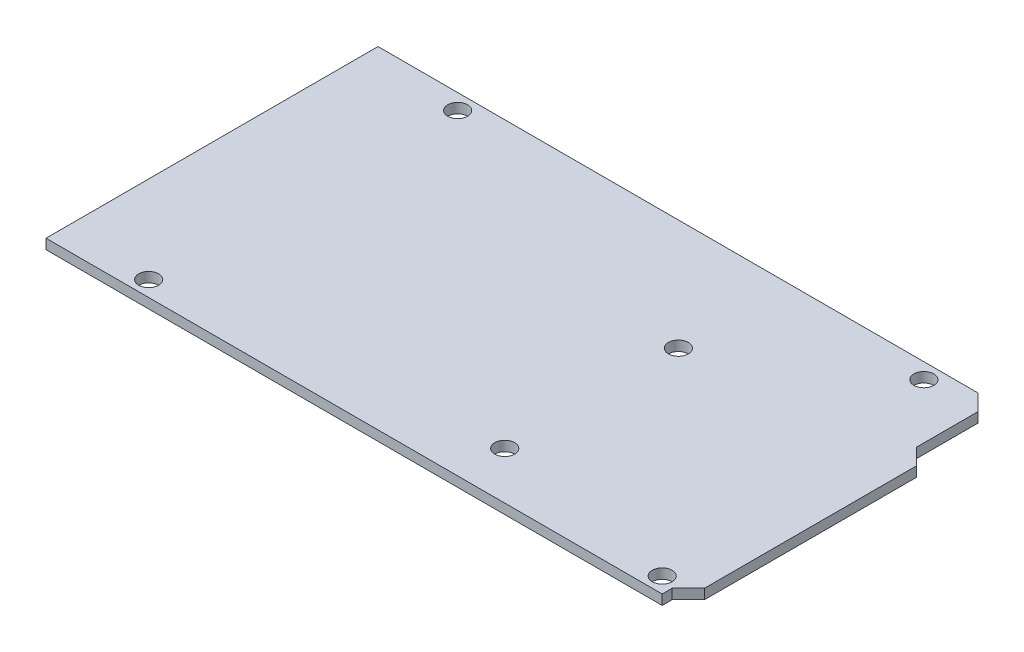
ISO-10303-21;
HEADER;
FILE_DESCRIPTION(('STEP AP214'),'2;1');
FILE_NAME('part.step','',(''),(''),'','','');
FILE_SCHEMA(('AUTOMOTIVE_DESIGN { 1 0 10303 214 1 1 1 1 }'));
ENDSEC;
DATA;
#1=APPLICATION_CONTEXT('core data for automotive mechanical design processes');
#2=APPLICATION_PROTOCOL_DEFINITION('international standard','automotive_design',2000,#1);
#3=PRODUCT_CONTEXT('',#1,'mechanical');
#4=PRODUCT('Part','Part','',(#3));
#5=PRODUCT_RELATED_PRODUCT_CATEGORY('part','',(#4));
#6=PRODUCT_DEFINITION_FORMATION('','',#4);
#7=PRODUCT_DEFINITION_CONTEXT('part definition',#1,'design');
#8=PRODUCT_DEFINITION('design','',#6,#7);
#9=PRODUCT_DEFINITION_SHAPE('','',#8);
#10=(LENGTH_UNIT() NAMED_UNIT(*) SI_UNIT(.MILLI.,.METRE.));
#11=(NAMED_UNIT(*) PLANE_ANGLE_UNIT() SI_UNIT($,.RADIAN.));
#12=(NAMED_UNIT(*) SI_UNIT($,.STERADIAN.) SOLID_ANGLE_UNIT());
#13=UNCERTAINTY_MEASURE_WITH_UNIT(LENGTH_MEASURE(1.E-05),#10,'distance_accuracy_value','');
#14=(GEOMETRIC_REPRESENTATION_CONTEXT(3) GLOBAL_UNCERTAINTY_ASSIGNED_CONTEXT((#13)) GLOBAL_UNIT_ASSIGNED_CONTEXT((#10,
#11,#12)) REPRESENTATION_CONTEXT('',''));
#15=CARTESIAN_POINT('',(0.,0.,0.));
#16=DIRECTION('',(0.,0.,1.));
#17=DIRECTION('',(1.,0.,0.));
#18=AXIS2_PLACEMENT_3D('',#15,#16,#17);
#19=CARTESIAN_POINT('',(48.2000000000001,1.6,25.0700000000001));
#20=DIRECTION('',(-0.707106781186566,0.,-0.707106781186529));
#21=DIRECTION('',(-0.707106781186529,0.,0.707106781186566));
#22=AXIS2_PLACEMENT_3D('',#19,#20,#21);
#23=PLANE('',#22);
#24=DIRECTION('',(0.707106781186529,0.,-0.707106781186566));
#25=VECTOR('',#24,1.);
#26=CARTESIAN_POINT('',(48.2000000000001,0.,25.0700000000001));
#27=LINE('',#26,#25);
#28=CARTESIAN_POINT('',(48.2000000000001,0.,25.0700000000001));
#29=VERTEX_POINT('',#28);
#30=CARTESIAN_POINT('',(50.8,0.,22.47));
#31=VERTEX_POINT('',#30);
#32=EDGE_CURVE('E141',#29,#31,#27,.T.);
#33=ORIENTED_EDGE('',*,*,#32,.T.);
#34=DIRECTION('',(0.,-1.,0.));
#35=VECTOR('',#34,1.);
#36=CARTESIAN_POINT('',(50.8,1.6,22.47));
#37=LINE('',#36,#35);
#38=CARTESIAN_POINT('',(50.8,1.6,22.47));
#39=VERTEX_POINT('',#38);
#40=EDGE_CURVE('E11',#39,#31,#37,.T.);
#41=ORIENTED_EDGE('',*,*,#40,.F.);
#42=DIRECTION('',(0.707106781186529,0.,-0.707106781186566));
#43=VECTOR('',#42,1.);
#44=CARTESIAN_POINT('',(48.2000000000001,1.6,25.0700000000001));
#45=LINE('',#44,#43);
#46=CARTESIAN_POINT('',(48.2000000000001,1.6,25.0700000000001));
#47=VERTEX_POINT('',#46);
#48=EDGE_CURVE('E158',#47,#39,#45,.T.);
#49=ORIENTED_EDGE('',*,*,#48,.F.);
#50=DIRECTION('',(0.,-1.,0.));
#51=VECTOR('',#50,1.);
#52=CARTESIAN_POINT('',(48.2000000000001,1.6,25.0700000000001));
#53=LINE('',#52,#51);
#54=EDGE_CURVE('E137',#47,#29,#53,.T.);
#55=ORIENTED_EDGE('',*,*,#54,.T.);
#56=EDGE_LOOP('',(#33,#41,#49,#55));
#57=FACE_BOUND('',#56,.T.);
#58=ADVANCED_FACE('F37',(#57),#23,.F.);
#59=CARTESIAN_POINT('',(50.8,1.6,22.47));
#60=DIRECTION('',(-1.,0.,0.));
#61=DIRECTION('',(0.,0.,1.));
#62=AXIS2_PLACEMENT_3D('',#59,#60,#61);
#63=PLANE('',#62);
#64=DIRECTION('',(0.,0.,-1.));
#65=VECTOR('',#64,1.);
#66=CARTESIAN_POINT('',(50.8,0.,22.47));
#67=LINE('',#66,#65);
#68=CARTESIAN_POINT('',(50.8,0.,-11.5868711410477));
#69=VERTEX_POINT('',#68);
#70=EDGE_CURVE('E144',#31,#69,#67,.T.);
#71=ORIENTED_EDGE('',*,*,#70,.T.);
#72=DIRECTION('',(0.,-1.,0.));
#73=VECTOR('',#72,1.);
#74=CARTESIAN_POINT('',(50.8,1.6,-11.5868711410477));
#75=LINE('',#74,#73);
#76=CARTESIAN_POINT('',(50.8,1.6,-11.5868711410477));
#77=VERTEX_POINT('',#76);
#78=EDGE_CURVE('E46',#77,#69,#75,.T.);
#79=ORIENTED_EDGE('',*,*,#78,.F.);
#80=DIRECTION('',(0.,0.,-1.));
#81=VECTOR('',#80,1.);
#82=CARTESIAN_POINT('',(50.8,1.6,22.47));
#83=LINE('',#82,#81);
#84=EDGE_CURVE('E101',#39,#77,#83,.T.);
#85=ORIENTED_EDGE('',*,*,#84,.F.);
#86=ORIENTED_EDGE('',*,*,#40,.T.);
#87=EDGE_LOOP('',(#71,#79,#85,#86));
#88=FACE_BOUND('',#87,.T.);
#89=ADVANCED_FACE('F244',(#88),#63,.F.);
#90=CARTESIAN_POINT('',(50.8,1.6,-11.5868711410477));
#91=DIRECTION('',(-0.707106781186548,0.,0.707106781186548));
#92=DIRECTION('',(0.707106781186548,0.,0.707106781186548));
#93=AXIS2_PLACEMENT_3D('',#90,#91,#92);
#94=PLANE('',#93);
#95=DIRECTION('',(-0.707106781186547,0.,-0.707106781186547));
#96=VECTOR('',#95,1.);
#97=CARTESIAN_POINT('',(50.8,0.,-11.5868711410477));
#98=LINE('',#97,#96);
#99=CARTESIAN_POINT('',(48.2,0.,-14.1868711410477));
#100=VERTEX_POINT('',#99);
#101=EDGE_CURVE('E147',#69,#100,#98,.T.);
#102=ORIENTED_EDGE('',*,*,#101,.T.);
#103=DIRECTION('',(0.,-1.,0.));
#104=VECTOR('',#103,1.);
#105=CARTESIAN_POINT('',(48.2,1.6,-14.1868711410477));
#106=LINE('',#105,#104);
#107=CARTESIAN_POINT('',(48.2,1.6,-14.1868711410477));
#108=VERTEX_POINT('',#107);
#109=EDGE_CURVE('E168',#108,#100,#106,.T.);
#110=ORIENTED_EDGE('',*,*,#109,.F.);
#111=DIRECTION('',(-0.707106781186547,0.,-0.707106781186547));
#112=VECTOR('',#111,1.);
#113=CARTESIAN_POINT('',(50.8,1.6,-11.5868711410477));
#114=LINE('',#113,#112);
#115=EDGE_CURVE('E210',#77,#108,#114,.T.);
#116=ORIENTED_EDGE('',*,*,#115,.F.);
#117=ORIENTED_EDGE('',*,*,#78,.T.);
#118=EDGE_LOOP('',(#102,#110,#116,#117));
#119=FACE_BOUND('',#118,.T.);
#120=ADVANCED_FACE('F248',(#119),#94,.F.);
#121=CARTESIAN_POINT('',(48.2,1.6,-24.0700000000001));
#122=DIRECTION('',(-1.,0.,0.));
#123=DIRECTION('',(0.,0.,1.));
#124=AXIS2_PLACEMENT_3D('',#121,#122,#123);
#125=PLANE('',#124);
#126=DIRECTION('',(0.,0.,-1.));
#127=VECTOR('',#126,1.);
#128=CARTESIAN_POINT('',(48.2,0.,-24.0700000000001));
#129=LINE('',#128,#127);
#130=CARTESIAN_POINT('',(48.2,0.,-24.0700000000001));
#131=VERTEX_POINT('',#130);
#132=EDGE_CURVE('E149',#100,#131,#129,.T.);
#133=ORIENTED_EDGE('',*,*,#132,.T.);
#134=DIRECTION('',(0.,-1.,0.));
#135=VECTOR('',#134,1.);
#136=CARTESIAN_POINT('',(48.2,1.6,-24.0700000000001));
#137=LINE('',#136,#135);
#138=CARTESIAN_POINT('',(48.2,1.6,-24.0700000000001));
#139=VERTEX_POINT('',#138);
#140=EDGE_CURVE('E165',#139,#131,#137,.T.);
#141=ORIENTED_EDGE('',*,*,#140,.F.);
#142=DIRECTION('',(0.,0.,-1.));
#143=VECTOR('',#142,1.);
#144=CARTESIAN_POINT('',(48.2,1.6,-24.0700000000001));
#145=LINE('',#144,#143);
#146=EDGE_CURVE('E212',#108,#139,#145,.T.);
#147=ORIENTED_EDGE('',*,*,#146,.F.);
#148=ORIENTED_EDGE('',*,*,#109,.T.);
#149=EDGE_LOOP('',(#133,#141,#147,#148));
#150=FACE_BOUND('',#149,.T.);
#151=ADVANCED_FACE('F252',(#150),#125,.F.);
#152=CARTESIAN_POINT('',(45.6,1.6,-26.67));
#153=DIRECTION('',(-0.707106781186543,0.,0.707106781186552));
#154=DIRECTION('',(0.707106781186552,0.,0.707106781186543));
#155=AXIS2_PLACEMENT_3D('',#152,#153,#154);
#156=PLANE('',#155);
#157=DIRECTION('',(-0.707106781186552,0.,-0.707106781186543));
#158=VECTOR('',#157,1.);
#159=CARTESIAN_POINT('',(45.6,0.,-26.67));
#160=LINE('',#159,#158);
#161=CARTESIAN_POINT('',(45.6,0.,-26.67));
#162=VERTEX_POINT('',#161);
#163=EDGE_CURVE('E151',#131,#162,#160,.T.);
#164=ORIENTED_EDGE('',*,*,#163,.T.);
#165=DIRECTION('',(0.,-1.,0.));
#166=VECTOR('',#165,1.);
#167=CARTESIAN_POINT('',(45.6,1.6,-26.67));
#168=LINE('',#167,#166);
#169=CARTESIAN_POINT('',(45.6,1.6,-26.67));
#170=VERTEX_POINT('',#169);
#171=EDGE_CURVE('E162',#170,#162,#168,.T.);
#172=ORIENTED_EDGE('',*,*,#171,.F.);
#173=DIRECTION('',(-0.707106781186552,0.,-0.707106781186543));
#174=VECTOR('',#173,1.);
#175=CARTESIAN_POINT('',(45.6,1.6,-26.67));
#176=LINE('',#175,#174);
#177=EDGE_CURVE('E214',#139,#170,#176,.T.);
#178=ORIENTED_EDGE('',*,*,#177,.F.);
#179=ORIENTED_EDGE('',*,*,#140,.T.);
#180=EDGE_LOOP('',(#164,#172,#178,#179));
#181=FACE_BOUND('',#180,.T.);
#182=ADVANCED_FACE('F220',(#181),#156,.F.);
#183=CARTESIAN_POINT('',(45.6,1.6,-26.67));
#184=DIRECTION('',(0.,0.,1.));
#185=DIRECTION('',(1.,0.,0.));
#186=AXIS2_PLACEMENT_3D('',#183,#184,#185);
#187=PLANE('',#186);
#188=DIRECTION('',(-1.,0.,0.));
#189=VECTOR('',#188,1.);
#190=CARTESIAN_POINT('',(45.6,0.,-26.67));
#191=LINE('',#190,#189);
#192=CARTESIAN_POINT('',(-50.8,0.,-26.67));
#193=VERTEX_POINT('',#192);
#194=EDGE_CURVE('E153',#162,#193,#191,.T.);
#195=ORIENTED_EDGE('',*,*,#194,.T.);
#196=DIRECTION('',(0.,-1.,0.));
#197=VECTOR('',#196,1.);
#198=CARTESIAN_POINT('',(-50.8,1.6,-26.67));
#199=LINE('',#198,#197);
#200=CARTESIAN_POINT('',(-50.8,1.6,-26.67));
#201=VERTEX_POINT('',#200);
#202=EDGE_CURVE('E132',#201,#193,#199,.T.);
#203=ORIENTED_EDGE('',*,*,#202,.F.);
#204=DIRECTION('',(-1.,0.,0.));
#205=VECTOR('',#204,1.);
#206=CARTESIAN_POINT('',(45.6,1.6,-26.67));
#207=LINE('',#206,#205);
#208=EDGE_CURVE('E123',#170,#201,#207,.T.);
#209=ORIENTED_EDGE('',*,*,#208,.F.);
#210=ORIENTED_EDGE('',*,*,#171,.T.);
#211=EDGE_LOOP('',(#195,#203,#209,#210));
#212=FACE_BOUND('',#211,.T.);
#213=ADVANCED_FACE('F224',(#212),#187,.F.);
#214=CARTESIAN_POINT('',(-50.8,1.6,26.67));
#215=DIRECTION('',(1.,0.,0.));
#216=DIRECTION('',(0.,0.,-1.));
#217=AXIS2_PLACEMENT_3D('',#214,#215,#216);
#218=PLANE('',#217);
#219=DIRECTION('',(0.,0.,1.));
#220=VECTOR('',#219,1.);
#221=CARTESIAN_POINT('',(-50.8,0.,26.67));
#222=LINE('',#221,#220);
#223=CARTESIAN_POINT('',(-50.8,0.,26.67));
#224=VERTEX_POINT('',#223);
#225=EDGE_CURVE('E131',#193,#224,#222,.T.);
#226=ORIENTED_EDGE('',*,*,#225,.T.);
#227=DIRECTION('',(0.,-1.,0.));
#228=VECTOR('',#227,1.);
#229=CARTESIAN_POINT('',(-50.8,1.6,26.67));
#230=LINE('',#229,#228);
#231=CARTESIAN_POINT('',(-50.8,1.6,26.67));
#232=VERTEX_POINT('',#231);
#233=EDGE_CURVE('E128',#232,#224,#230,.T.);
#234=ORIENTED_EDGE('',*,*,#233,.F.);
#235=DIRECTION('',(0.,0.,1.));
#236=VECTOR('',#235,1.);
#237=CARTESIAN_POINT('',(-50.8,1.6,26.67));
#238=LINE('',#237,#236);
#239=EDGE_CURVE('E117',#201,#232,#238,.T.);
#240=ORIENTED_EDGE('',*,*,#239,.F.);
#241=ORIENTED_EDGE('',*,*,#202,.T.);
#242=EDGE_LOOP('',(#226,#234,#240,#241));
#243=FACE_BOUND('',#242,.T.);
#244=ADVANCED_FACE('F129',(#243),#218,.F.);
#245=CARTESIAN_POINT('',(48.2000000000001,1.6,26.6700000000001));
#246=DIRECTION('',(0.,0.,-1.));
#247=DIRECTION('',(-1.,0.,0.));
#248=AXIS2_PLACEMENT_3D('',#245,#246,#247);
#249=PLANE('',#248);
#250=DIRECTION('',(1.,0.,0.));
#251=VECTOR('',#250,1.);
#252=CARTESIAN_POINT('',(48.2000000000001,0.,26.6700000000001));
#253=LINE('',#252,#251);
#254=CARTESIAN_POINT('',(48.2000000000001,0.,26.6700000000001));
#255=VERTEX_POINT('',#254);
#256=EDGE_CURVE('E87',#224,#255,#253,.T.);
#257=ORIENTED_EDGE('',*,*,#256,.T.);
#258=DIRECTION('',(0.,-1.,0.));
#259=VECTOR('',#258,1.);
#260=CARTESIAN_POINT('',(48.2000000000001,1.6,26.6700000000001));
#261=LINE('',#260,#259);
#262=CARTESIAN_POINT('',(48.2000000000001,1.6,26.6700000000001));
#263=VERTEX_POINT('',#262);
#264=EDGE_CURVE('E133',#263,#255,#261,.T.);
#265=ORIENTED_EDGE('',*,*,#264,.F.);
#266=DIRECTION('',(1.,0.,0.));
#267=VECTOR('',#266,1.);
#268=CARTESIAN_POINT('',(48.2000000000001,1.6,26.6700000000001));
#269=LINE('',#268,#267);
#270=EDGE_CURVE('E121',#232,#263,#269,.T.);
#271=ORIENTED_EDGE('',*,*,#270,.F.);
#272=ORIENTED_EDGE('',*,*,#233,.T.);
#273=EDGE_LOOP('',(#257,#265,#271,#272));
#274=FACE_BOUND('',#273,.T.);
#275=ADVANCED_FACE('F135',(#274),#249,.F.);
#276=CARTESIAN_POINT('',(48.2000000000001,1.6,25.0700000000001));
#277=DIRECTION('',(-1.,0.,0.));
#278=DIRECTION('',(0.,0.,1.));
#279=AXIS2_PLACEMENT_3D('',#276,#277,#278);
#280=PLANE('',#279);
#281=DIRECTION('',(0.,0.,-1.));
#282=VECTOR('',#281,1.);
#283=CARTESIAN_POINT('',(48.2000000000001,0.,25.0700000000001));
#284=LINE('',#283,#282);
#285=EDGE_CURVE('E93',#255,#29,#284,.T.);
#286=ORIENTED_EDGE('',*,*,#285,.T.);
#287=ORIENTED_EDGE('',*,*,#54,.F.);
#288=DIRECTION('',(0.,0.,-1.));
#289=VECTOR('',#288,1.);
#290=CARTESIAN_POINT('',(48.2000000000001,1.6,25.0700000000001));
#291=LINE('',#290,#289);
#292=EDGE_CURVE('E55',#263,#47,#291,.T.);
#293=ORIENTED_EDGE('',*,*,#292,.F.);
#294=ORIENTED_EDGE('',*,*,#264,.T.);
#295=EDGE_LOOP('',(#286,#287,#293,#294));
#296=FACE_BOUND('',#295,.T.);
#297=ADVANCED_FACE('F232',(#296),#280,.F.);
#298=CARTESIAN_POINT('',(67.8284355705234,1.6,5.44156442947573));
#299=DIRECTION('',(0.,1.,0.));
#300=DIRECTION('',(0.,0.,1.));
#301=AXIS2_PLACEMENT_3D('',#298,#299,#300);
#302=PLANE('',#301);
#303=CARTESIAN_POINT('',(15.3,1.6,19.07));
#304=DIRECTION('',(0.,1.,0.));
#305=DIRECTION('',(0.,0.,1.));
#306=AXIS2_PLACEMENT_3D('',#303,#304,#305);
#307=CIRCLE('',#306,1.6);
#308=CARTESIAN_POINT('',(15.3,1.6,20.67));
#309=VERTEX_POINT('',#308);
#310=EDGE_CURVE('E199',#309,#309,#307,.T.);
#311=ORIENTED_EDGE('',*,*,#310,.F.);
#312=EDGE_LOOP('',(#311));
#313=FACE_BOUND('',#312,.T.);
#314=CARTESIAN_POINT('',(15.3,1.6,-8.82999999999999));
#315=DIRECTION('',(0.,1.,0.));
#316=DIRECTION('',(0.,0.,1.));
#317=AXIS2_PLACEMENT_3D('',#314,#315,#316);
#318=CIRCLE('',#317,1.6);
#319=CARTESIAN_POINT('',(15.3,1.6,-7.22999999999999));
#320=VERTEX_POINT('',#319);
#321=EDGE_CURVE('E189',#320,#320,#318,.T.);
#322=ORIENTED_EDGE('',*,*,#321,.F.);
#323=EDGE_LOOP('',(#322));
#324=FACE_BOUND('',#323,.T.);
#325=CARTESIAN_POINT('',(45.7000000000001,1.6,24.17));
#326=DIRECTION('',(0.,1.,0.));
#327=DIRECTION('',(0.,0.,1.));
#328=AXIS2_PLACEMENT_3D('',#325,#326,#327);
#329=CIRCLE('',#328,1.6);
#330=CARTESIAN_POINT('',(45.7000000000001,1.6,25.77));
#331=VERTEX_POINT('',#330);
#332=EDGE_CURVE('E186',#331,#331,#329,.T.);
#333=ORIENTED_EDGE('',*,*,#332,.F.);
#334=EDGE_LOOP('',(#333));
#335=FACE_BOUND('',#334,.T.);
#336=CARTESIAN_POINT('',(39.4,1.6,-24.17));
#337=DIRECTION('',(0.,1.,0.));
#338=DIRECTION('',(0.,0.,1.));
#339=AXIS2_PLACEMENT_3D('',#336,#337,#338);
#340=CIRCLE('',#339,1.6);
#341=CARTESIAN_POINT('',(39.4,1.6,-22.57));
#342=VERTEX_POINT('',#341);
#343=EDGE_CURVE('E183',#342,#342,#340,.T.);
#344=ORIENTED_EDGE('',*,*,#343,.F.);
#345=EDGE_LOOP('',(#344));
#346=FACE_BOUND('',#345,.T.);
#347=CARTESIAN_POINT('',(-36.8,1.6,24.17));
#348=DIRECTION('',(0.,1.,0.));
#349=DIRECTION('',(0.,0.,1.));
#350=AXIS2_PLACEMENT_3D('',#347,#348,#349);
#351=CIRCLE('',#350,1.6);
#352=CARTESIAN_POINT('',(-36.8,1.6,25.77));
#353=VERTEX_POINT('',#352);
#354=EDGE_CURVE('E179',#353,#353,#351,.T.);
#355=ORIENTED_EDGE('',*,*,#354,.F.);
#356=EDGE_LOOP('',(#355));
#357=FACE_BOUND('',#356,.T.);
#358=CARTESIAN_POINT('',(-35.5,1.6,-24.17));
#359=DIRECTION('',(0.,1.,0.));
#360=DIRECTION('',(0.,0.,1.));
#361=AXIS2_PLACEMENT_3D('',#358,#359,#360);
#362=CIRCLE('',#361,1.6);
#363=CARTESIAN_POINT('',(-35.5,1.6,-22.57));
#364=VERTEX_POINT('',#363);
#365=EDGE_CURVE('E175',#364,#364,#362,.T.);
#366=ORIENTED_EDGE('',*,*,#365,.F.);
#367=EDGE_LOOP('',(#366));
#368=FACE_BOUND('',#367,.T.);
#369=ORIENTED_EDGE('',*,*,#48,.T.);
#370=ORIENTED_EDGE('',*,*,#84,.T.);
#371=ORIENTED_EDGE('',*,*,#115,.T.);
#372=ORIENTED_EDGE('',*,*,#146,.T.);
#373=ORIENTED_EDGE('',*,*,#177,.T.);
#374=ORIENTED_EDGE('',*,*,#208,.T.);
#375=ORIENTED_EDGE('',*,*,#239,.T.);
#376=ORIENTED_EDGE('',*,*,#270,.T.);
#377=ORIENTED_EDGE('',*,*,#292,.T.);
#378=EDGE_LOOP('',(#369,#370,#371,#372,#373,#374,#375,#376,#377));
#379=FACE_BOUND('',#378,.T.);
#380=ADVANCED_FACE('F119',(#313,#324,#335,#346,#357,#368,#379),#302,.T.);
#381=CARTESIAN_POINT('',(67.8284355705234,0.,5.44156442947573));
#382=DIRECTION('',(0.,1.,0.));
#383=DIRECTION('',(0.,0.,1.));
#384=AXIS2_PLACEMENT_3D('',#381,#382,#383);
#385=PLANE('',#384);
#386=CARTESIAN_POINT('',(15.3,0.,19.07));
#387=DIRECTION('',(0.,1.,0.));
#388=DIRECTION('',(0.,0.,1.));
#389=AXIS2_PLACEMENT_3D('',#386,#387,#388);
#390=CIRCLE('',#389,1.6);
#391=CARTESIAN_POINT('',(15.3,0.,20.67));
#392=VERTEX_POINT('',#391);
#393=EDGE_CURVE('E40',#392,#392,#390,.T.);
#394=ORIENTED_EDGE('',*,*,#393,.T.);
#395=EDGE_LOOP('',(#394));
#396=FACE_BOUND('',#395,.T.);
#397=CARTESIAN_POINT('',(15.3,0.,-8.82999999999999));
#398=DIRECTION('',(0.,1.,0.));
#399=DIRECTION('',(0.,0.,1.));
#400=AXIS2_PLACEMENT_3D('',#397,#398,#399);
#401=CIRCLE('',#400,1.6);
#402=CARTESIAN_POINT('',(15.3,0.,-7.22999999999999));
#403=VERTEX_POINT('',#402);
#404=EDGE_CURVE('E187',#403,#403,#401,.T.);
#405=ORIENTED_EDGE('',*,*,#404,.T.);
#406=EDGE_LOOP('',(#405));
#407=FACE_BOUND('',#406,.T.);
#408=CARTESIAN_POINT('',(45.7000000000001,0.,24.17));
#409=DIRECTION('',(0.,1.,0.));
#410=DIRECTION('',(0.,0.,1.));
#411=AXIS2_PLACEMENT_3D('',#408,#409,#410);
#412=CIRCLE('',#411,1.6);
#413=CARTESIAN_POINT('',(45.7000000000001,0.,25.77));
#414=VERTEX_POINT('',#413);
#415=EDGE_CURVE('E184',#414,#414,#412,.T.);
#416=ORIENTED_EDGE('',*,*,#415,.T.);
#417=EDGE_LOOP('',(#416));
#418=FACE_BOUND('',#417,.T.);
#419=CARTESIAN_POINT('',(39.4,0.,-24.17));
#420=DIRECTION('',(0.,1.,0.));
#421=DIRECTION('',(0.,0.,1.));
#422=AXIS2_PLACEMENT_3D('',#419,#420,#421);
#423=CIRCLE('',#422,1.6);
#424=CARTESIAN_POINT('',(39.4,0.,-22.57));
#425=VERTEX_POINT('',#424);
#426=EDGE_CURVE('E180',#425,#425,#423,.T.);
#427=ORIENTED_EDGE('',*,*,#426,.T.);
#428=EDGE_LOOP('',(#427));
#429=FACE_BOUND('',#428,.T.);
#430=CARTESIAN_POINT('',(-36.8,0.,24.17));
#431=DIRECTION('',(0.,1.,0.));
#432=DIRECTION('',(0.,0.,1.));
#433=AXIS2_PLACEMENT_3D('',#430,#431,#432);
#434=CIRCLE('',#433,1.6);
#435=CARTESIAN_POINT('',(-36.8,0.,25.77));
#436=VERTEX_POINT('',#435);
#437=EDGE_CURVE('E176',#436,#436,#434,.T.);
#438=ORIENTED_EDGE('',*,*,#437,.T.);
#439=EDGE_LOOP('',(#438));
#440=FACE_BOUND('',#439,.T.);
#441=CARTESIAN_POINT('',(-35.5,0.,-24.17));
#442=DIRECTION('',(0.,1.,0.));
#443=DIRECTION('',(0.,0.,1.));
#444=AXIS2_PLACEMENT_3D('',#441,#442,#443);
#445=CIRCLE('',#444,1.6);
#446=CARTESIAN_POINT('',(-35.5,0.,-22.57));
#447=VERTEX_POINT('',#446);
#448=EDGE_CURVE('E145',#447,#447,#445,.T.);
#449=ORIENTED_EDGE('',*,*,#448,.T.);
#450=EDGE_LOOP('',(#449));
#451=FACE_BOUND('',#450,.T.);
#452=ORIENTED_EDGE('',*,*,#32,.F.);
#453=ORIENTED_EDGE('',*,*,#285,.F.);
#454=ORIENTED_EDGE('',*,*,#256,.F.);
#455=ORIENTED_EDGE('',*,*,#225,.F.);
#456=ORIENTED_EDGE('',*,*,#194,.F.);
#457=ORIENTED_EDGE('',*,*,#163,.F.);
#458=ORIENTED_EDGE('',*,*,#132,.F.);
#459=ORIENTED_EDGE('',*,*,#101,.F.);
#460=ORIENTED_EDGE('',*,*,#70,.F.);
#461=EDGE_LOOP('',(#452,#453,#454,#455,#456,#457,#458,#459,#460));
#462=FACE_BOUND('',#461,.T.);
#463=ADVANCED_FACE('F227',(#396,#407,#418,#429,#440,#451,#462),#385,.F.);
#464=CARTESIAN_POINT('',(-35.5,-8.4,-24.17));
#465=DIRECTION('',(0.,1.,0.));
#466=DIRECTION('',(0.,0.,1.));
#467=AXIS2_PLACEMENT_3D('',#464,#465,#466);
#468=CYLINDRICAL_SURFACE('',#467,1.6);
#469=ORIENTED_EDGE('',*,*,#365,.T.);
#470=EDGE_LOOP('',(#469));
#471=FACE_BOUND('',#470,.T.);
#472=ORIENTED_EDGE('',*,*,#448,.F.);
#473=EDGE_LOOP('',(#472));
#474=FACE_BOUND('',#473,.T.);
#475=ADVANCED_FACE('F292',(#471,#474),#468,.F.);
#476=CARTESIAN_POINT('',(-36.8,-8.4,24.17));
#477=DIRECTION('',(0.,1.,0.));
#478=DIRECTION('',(0.,0.,1.));
#479=AXIS2_PLACEMENT_3D('',#476,#477,#478);
#480=CYLINDRICAL_SURFACE('',#479,1.6);
#481=ORIENTED_EDGE('',*,*,#354,.T.);
#482=EDGE_LOOP('',(#481));
#483=FACE_BOUND('',#482,.T.);
#484=ORIENTED_EDGE('',*,*,#437,.F.);
#485=EDGE_LOOP('',(#484));
#486=FACE_BOUND('',#485,.T.);
#487=ADVANCED_FACE('F301',(#483,#486),#480,.F.);
#488=CARTESIAN_POINT('',(39.4,-8.4,-24.17));
#489=DIRECTION('',(0.,1.,0.));
#490=DIRECTION('',(0.,0.,1.));
#491=AXIS2_PLACEMENT_3D('',#488,#489,#490);
#492=CYLINDRICAL_SURFACE('',#491,1.6);
#493=ORIENTED_EDGE('',*,*,#343,.T.);
#494=EDGE_LOOP('',(#493));
#495=FACE_BOUND('',#494,.T.);
#496=ORIENTED_EDGE('',*,*,#426,.F.);
#497=EDGE_LOOP('',(#496));
#498=FACE_BOUND('',#497,.T.);
#499=ADVANCED_FACE('F311',(#495,#498),#492,.F.);
#500=CARTESIAN_POINT('',(45.7000000000001,-8.4,24.17));
#501=DIRECTION('',(0.,1.,0.));
#502=DIRECTION('',(0.,0.,1.));
#503=AXIS2_PLACEMENT_3D('',#500,#501,#502);
#504=CYLINDRICAL_SURFACE('',#503,1.6);
#505=ORIENTED_EDGE('',*,*,#332,.T.);
#506=EDGE_LOOP('',(#505));
#507=FACE_BOUND('',#506,.T.);
#508=ORIENTED_EDGE('',*,*,#415,.F.);
#509=EDGE_LOOP('',(#508));
#510=FACE_BOUND('',#509,.T.);
#511=ADVANCED_FACE('F321',(#507,#510),#504,.F.);
#512=CARTESIAN_POINT('',(15.3,-8.4,-8.82999999999999));
#513=DIRECTION('',(0.,1.,0.));
#514=DIRECTION('',(0.,0.,1.));
#515=AXIS2_PLACEMENT_3D('',#512,#513,#514);
#516=CYLINDRICAL_SURFACE('',#515,1.6);
#517=ORIENTED_EDGE('',*,*,#321,.T.);
#518=EDGE_LOOP('',(#517));
#519=FACE_BOUND('',#518,.T.);
#520=ORIENTED_EDGE('',*,*,#404,.F.);
#521=EDGE_LOOP('',(#520));
#522=FACE_BOUND('',#521,.T.);
#523=ADVANCED_FACE('F331',(#519,#522),#516,.F.);
#524=CARTESIAN_POINT('',(15.3,-8.4,19.07));
#525=DIRECTION('',(0.,1.,0.));
#526=DIRECTION('',(0.,0.,1.));
#527=AXIS2_PLACEMENT_3D('',#524,#525,#526);
#528=CYLINDRICAL_SURFACE('',#527,1.6);
#529=ORIENTED_EDGE('',*,*,#310,.T.);
#530=EDGE_LOOP('',(#529));
#531=FACE_BOUND('',#530,.T.);
#532=ORIENTED_EDGE('',*,*,#393,.F.);
#533=EDGE_LOOP('',(#532));
#534=FACE_BOUND('',#533,.T.);
#535=ADVANCED_FACE('F341',(#531,#534),#528,.F.);
#536=CLOSED_SHELL('',(#58,#89,#120,#151,#182,#213,#244,#275,#297,#380,#463,#475,#487,#499,#511,
#523,#535));
#537=MANIFOLD_SOLID_BREP('B2',#536);
#538=ADVANCED_BREP_SHAPE_REPRESENTATION('',(#18,#537),#14);
#539=SHAPE_DEFINITION_REPRESENTATION(#9,#538);
ENDSEC;
END-ISO-10303-21;
